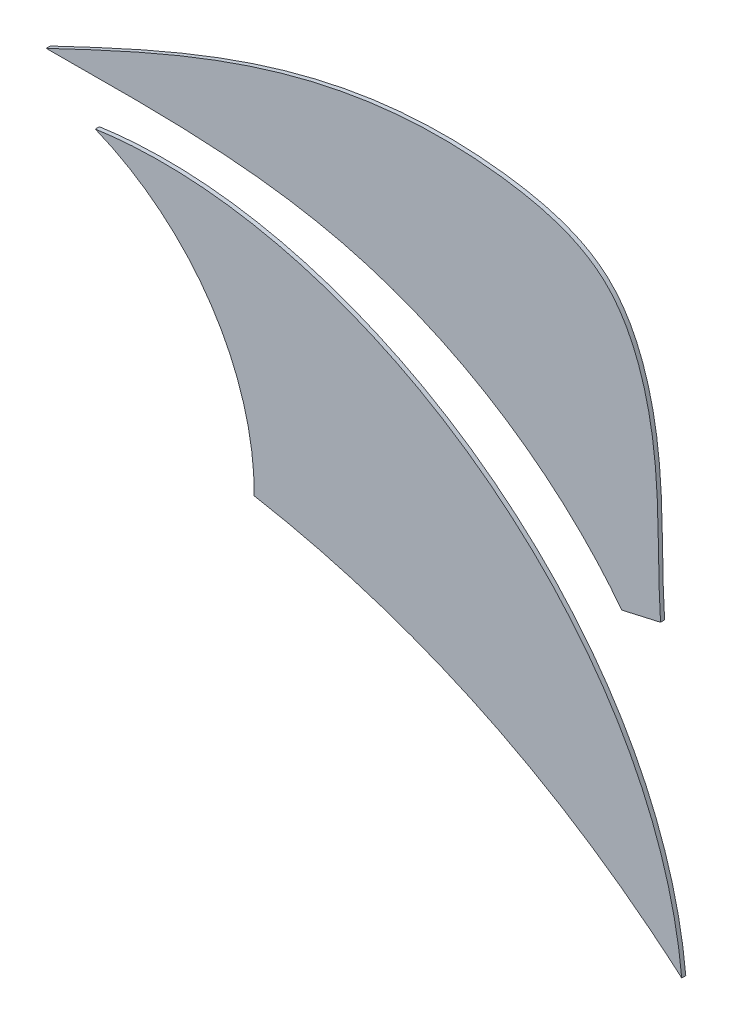
ISO-10303-21;
HEADER;
FILE_DESCRIPTION(('STEP AP214'),'2;1');
FILE_NAME('part.step','',(''),(''),'','','');
FILE_SCHEMA(('AUTOMOTIVE_DESIGN { 1 0 10303 214 1 1 1 1 }'));
ENDSEC;
DATA;
#1=APPLICATION_CONTEXT('core data for automotive mechanical design processes');
#2=APPLICATION_PROTOCOL_DEFINITION('international standard','automotive_design',2000,#1);
#3=PRODUCT_CONTEXT('',#1,'mechanical');
#4=PRODUCT('Part','Part','',(#3));
#5=PRODUCT_RELATED_PRODUCT_CATEGORY('part','',(#4));
#6=PRODUCT_DEFINITION_FORMATION('','',#4);
#7=PRODUCT_DEFINITION_CONTEXT('part definition',#1,'design');
#8=PRODUCT_DEFINITION('design','',#6,#7);
#9=PRODUCT_DEFINITION_SHAPE('','',#8);
#10=(LENGTH_UNIT() NAMED_UNIT(*) SI_UNIT(.MILLI.,.METRE.));
#11=(NAMED_UNIT(*) PLANE_ANGLE_UNIT() SI_UNIT($,.RADIAN.));
#12=(NAMED_UNIT(*) SI_UNIT($,.STERADIAN.) SOLID_ANGLE_UNIT());
#13=UNCERTAINTY_MEASURE_WITH_UNIT(LENGTH_MEASURE(1.E-05),#10,'distance_accuracy_value','');
#14=(GEOMETRIC_REPRESENTATION_CONTEXT(3) GLOBAL_UNCERTAINTY_ASSIGNED_CONTEXT((#13)) GLOBAL_UNIT_ASSIGNED_CONTEXT((#10,
#11,#12)) REPRESENTATION_CONTEXT('',''));
#15=CARTESIAN_POINT('',(0.,0.,0.));
#16=DIRECTION('',(0.,0.,1.));
#17=DIRECTION('',(1.,0.,0.));
#18=AXIS2_PLACEMENT_3D('',#15,#16,#17);
#19=CARTESIAN_POINT('',(-12.604061511027,13.5285490469243,0.6));
#20=CARTESIAN_POINT('',(-16.5763308281484,54.6631563552103,0.6));
#21=CARTESIAN_POINT('',(-59.4761934889544,84.373919060689,0.6));
#22=CARTESIAN_POINT('',(-99.0383095872289,78.678306614826,0.6));
#23=B_SPLINE_CURVE_WITH_KNOTS('',3,(#19,#20,#21,#22),.UNSPECIFIED.,.F.,.F.,(4,4),(0.,1.),.UNSPECIFIED.);
#24=DIRECTION('',(0.,0.,-1.));
#25=VECTOR('',#24,1.);
#26=SURFACE_OF_LINEAR_EXTRUSION('',#23,#25);
#27=CARTESIAN_POINT('',(-12.604061511027,13.5285490469243,0.));
#28=CARTESIAN_POINT('',(-16.5763308281484,54.6631563552103,0.));
#29=CARTESIAN_POINT('',(-59.4761934889544,84.373919060689,0.));
#30=CARTESIAN_POINT('',(-99.0383095872289,78.678306614826,0.));
#31=B_SPLINE_CURVE_WITH_KNOTS('',3,(#27,#28,#29,#30),.UNSPECIFIED.,.F.,.F.,(4,4),(0.,1.),.UNSPECIFIED.);
#32=CARTESIAN_POINT('',(-12.6040613969995,13.5285489480861,0.));
#33=VERTEX_POINT('',#32);
#34=CARTESIAN_POINT('',(-99.0383095872289,78.678306614826,0.));
#35=VERTEX_POINT('',#34);
#36=EDGE_CURVE('E12',#33,#35,#31,.T.);
#37=ORIENTED_EDGE('',*,*,#36,.T.);
#38=DIRECTION('',(0.,0.,-1.));
#39=VECTOR('',#38,1.);
#40=CARTESIAN_POINT('',(-99.0383095872289,78.678306614826,0.6));
#41=LINE('',#40,#39);
#42=CARTESIAN_POINT('',(-99.0383095872289,78.678306614826,0.6));
#43=VERTEX_POINT('',#42);
#44=EDGE_CURVE('E128',#43,#35,#41,.T.);
#45=ORIENTED_EDGE('',*,*,#44,.F.);
#46=CARTESIAN_POINT('',(-12.6040613969995,13.5285489480861,0.6));
#47=VERTEX_POINT('',#46);
#48=EDGE_CURVE('E55',#47,#43,#23,.T.);
#49=ORIENTED_EDGE('',*,*,#48,.F.);
#50=DIRECTION('',(0.,0.,-1.));
#51=VECTOR('',#50,1.);
#52=CARTESIAN_POINT('',(-12.6040613969995,13.5285489480861,0.6));
#53=LINE('',#52,#51);
#54=EDGE_CURVE('E96',#47,#33,#53,.T.);
#55=ORIENTED_EDGE('',*,*,#54,.T.);
#56=EDGE_LOOP('',(#37,#45,#49,#55));
#57=FACE_BOUND('',#56,.T.);
#58=ADVANCED_FACE('F51',(#57),#26,.F.);
#59=CARTESIAN_POINT('',(-113.180223453903,43.8762909601679,0.6));
#60=DIRECTION('',(0.,0.,-1.));
#61=DIRECTION('',(-1.,0.,0.));
#62=AXIS2_PLACEMENT_3D('',#59,#60,#61);
#63=CYLINDRICAL_SURFACE('',#62,37.5655962476237);
#64=CARTESIAN_POINT('',(-113.180223453903,43.8762909601679,0.));
#65=DIRECTION('',(0.,0.,-1.));
#66=DIRECTION('',(1.,0.,0.));
#67=AXIS2_PLACEMENT_3D('',#64,#65,#66);
#68=CIRCLE('',#67,37.5655962476237);
#69=CARTESIAN_POINT('',(-75.6158749428923,43.570118884184,0.));
#70=VERTEX_POINT('',#69);
#71=EDGE_CURVE('E64',#35,#70,#68,.T.);
#72=ORIENTED_EDGE('',*,*,#71,.T.);
#73=DIRECTION('',(0.,0.,-1.));
#74=VECTOR('',#73,1.);
#75=CARTESIAN_POINT('',(-75.6158749428923,43.570118884184,0.6));
#76=LINE('',#75,#74);
#77=CARTESIAN_POINT('',(-75.6158749428923,43.570118884184,0.6));
#78=VERTEX_POINT('',#77);
#79=EDGE_CURVE('E98',#78,#70,#76,.T.);
#80=ORIENTED_EDGE('',*,*,#79,.F.);
#81=CARTESIAN_POINT('',(-113.180223453903,43.8762909601679,0.6));
#82=DIRECTION('',(0.,0.,-1.));
#83=DIRECTION('',(1.,0.,0.));
#84=AXIS2_PLACEMENT_3D('',#81,#82,#83);
#85=CIRCLE('',#84,37.5655962476237);
#86=EDGE_CURVE('E85',#43,#78,#85,.T.);
#87=ORIENTED_EDGE('',*,*,#86,.F.);
#88=ORIENTED_EDGE('',*,*,#44,.T.);
#89=EDGE_LOOP('',(#72,#80,#87,#88));
#90=FACE_BOUND('',#89,.T.);
#91=ADVANCED_FACE('F111',(#90),#63,.F.);
#92=CARTESIAN_POINT('',(-455913.673790544,-890155.177278223,0.6));
#93=CARTESIAN_POINT('',(441538.938999984,897254.289809783,0.6));
#94=CARTESIAN_POINT('',(-427326.468098657,-904224.741316499,0.6));
#95=B_SPLINE_CURVE_WITH_KNOTS('',2,(#92,#93,#94),.UNSPECIFIED.,.F.,.F.,(3,3),(0.,1.),.UNSPECIFIED.);
#96=DIRECTION('',(0.,0.,-1.));
#97=VECTOR('',#96,1.);
#98=SURFACE_OF_LINEAR_EXTRUSION('',#95,#97);
#99=CARTESIAN_POINT('',(-455913.673790544,-890155.177278223,0.));
#100=CARTESIAN_POINT('',(441538.938999984,897254.289809783,0.));
#101=CARTESIAN_POINT('',(-427326.468098657,-904224.741316499,0.));
#102=B_SPLINE_CURVE_WITH_KNOTS('',2,(#99,#100,#101),.UNSPECIFIED.,.F.,.F.,(3,3),(0.,1.),.UNSPECIFIED.);
#103=EDGE_CURVE('E92',#70,#33,#102,.T.);
#104=ORIENTED_EDGE('',*,*,#103,.T.);
#105=ORIENTED_EDGE('',*,*,#54,.F.);
#106=EDGE_CURVE('E102',#78,#47,#95,.T.);
#107=ORIENTED_EDGE('',*,*,#106,.F.);
#108=ORIENTED_EDGE('',*,*,#79,.T.);
#109=EDGE_LOOP('',(#104,#105,#107,#108));
#110=FACE_BOUND('',#109,.T.);
#111=ADVANCED_FACE('F94',(#110),#98,.F.);
#112=CARTESIAN_POINT('',(-42.4749930061955,63.664760238681,0.6));
#113=DIRECTION('',(0.,0.,-1.));
#114=DIRECTION('',(-1.,0.,0.));
#115=AXIS2_PLACEMENT_3D('',#112,#113,#114);
#116=PLANE('',#115);
#117=ORIENTED_EDGE('',*,*,#48,.T.);
#118=ORIENTED_EDGE('',*,*,#86,.T.);
#119=ORIENTED_EDGE('',*,*,#106,.T.);
#120=EDGE_LOOP('',(#117,#118,#119));
#121=FACE_BOUND('',#120,.T.);
#122=ADVANCED_FACE('F53',(#121),#116,.F.);
#123=CARTESIAN_POINT('',(-42.4749930061955,63.664760238681,0.));
#124=DIRECTION('',(0.,0.,-1.));
#125=DIRECTION('',(-1.,0.,0.));
#126=AXIS2_PLACEMENT_3D('',#123,#124,#125);
#127=PLANE('',#126);
#128=ORIENTED_EDGE('',*,*,#36,.F.);
#129=ORIENTED_EDGE('',*,*,#103,.F.);
#130=ORIENTED_EDGE('',*,*,#71,.F.);
#131=EDGE_LOOP('',(#128,#129,#130));
#132=FACE_BOUND('',#131,.T.);
#133=ADVANCED_FACE('F104',(#132),#127,.T.);
#134=CLOSED_SHELL('',(#58,#91,#111,#122,#133));
#135=MANIFOLD_SOLID_BREP('B2',#134);
#136=CARTESIAN_POINT('',(-15.7324356038387,57.3725369791131,0.6));
#137=CARTESIAN_POINT('',(-16.3528748442375,66.6176840384339,0.6));
#138=CARTESIAN_POINT('',(-15.0941289247524,80.1408154700094,0.6));
#139=CARTESIAN_POINT('',(-23.0528951268825,99.1548395205853,0.6));
#140=CARTESIAN_POINT('',(-58.218524544496,108.015164996985,0.6));
#141=CARTESIAN_POINT('',(-85.4083096719593,95.3035572122187,0.6));
#142=CARTESIAN_POINT('',(-106.280242173504,85.3604745037555,0.6));
#143=B_SPLINE_CURVE_WITH_KNOTS('',3,(#136,#137,#138,#139,#140,#141,#142),.UNSPECIFIED.,.F.,.F.,
(4,1,1,1,4),(0.,0.217981108823508,0.32073340400496,0.449686820030178,1.),.UNSPECIFIED.);
#144=DIRECTION('',(0.,0.,-1.));
#145=VECTOR('',#144,1.);
#146=SURFACE_OF_LINEAR_EXTRUSION('',#143,#145);
#147=CARTESIAN_POINT('',(-15.7324356038387,57.3725369791131,0.));
#148=CARTESIAN_POINT('',(-16.3528748442375,66.6176840384339,0.));
#149=CARTESIAN_POINT('',(-15.0941289247524,80.1408154700094,0.));
#150=CARTESIAN_POINT('',(-23.0528951268825,99.1548395205853,0.));
#151=CARTESIAN_POINT('',(-58.218524544496,108.015164996985,0.));
#152=CARTESIAN_POINT('',(-85.4083096719593,95.3035572122187,0.));
#153=CARTESIAN_POINT('',(-106.280242173504,85.3604745037555,0.));
#154=B_SPLINE_CURVE_WITH_KNOTS('',3,(#147,#148,#149,#150,#151,#152,#153),.UNSPECIFIED.,.F.,.F.,
(4,1,1,1,4),(0.,0.217981108823508,0.32073340400496,0.449686820030178,1.),.UNSPECIFIED.);
#155=CARTESIAN_POINT('',(-15.7324356038387,57.3725369791131,0.));
#156=VERTEX_POINT('',#155);
#157=CARTESIAN_POINT('',(-106.280242173504,85.3604745037555,0.));
#158=VERTEX_POINT('',#157);
#159=EDGE_CURVE('E218',#156,#158,#154,.T.);
#160=ORIENTED_EDGE('',*,*,#159,.T.);
#161=DIRECTION('',(0.,0.,-1.));
#162=VECTOR('',#161,1.);
#163=CARTESIAN_POINT('',(-106.280242173504,85.3604745037555,0.6));
#164=LINE('',#163,#162);
#165=CARTESIAN_POINT('',(-106.280242173504,85.3604745037555,0.6));
#166=VERTEX_POINT('',#165);
#167=EDGE_CURVE('E49',#166,#158,#164,.T.);
#168=ORIENTED_EDGE('',*,*,#167,.F.);
#169=CARTESIAN_POINT('',(-15.7324356038387,57.3725369791131,0.6));
#170=VERTEX_POINT('',#169);
#171=EDGE_CURVE('E212',#170,#166,#143,.T.);
#172=ORIENTED_EDGE('',*,*,#171,.F.);
#173=DIRECTION('',(0.,0.,-1.));
#174=VECTOR('',#173,1.);
#175=CARTESIAN_POINT('',(-15.7324356038387,57.3725369791131,0.6));
#176=LINE('',#175,#174);
#177=EDGE_CURVE('E219',#170,#156,#176,.T.);
#178=ORIENTED_EDGE('',*,*,#177,.T.);
#179=EDGE_LOOP('',(#160,#168,#172,#178));
#180=FACE_BOUND('',#179,.T.);
#181=ADVANCED_FACE('F171',(#180),#146,.F.);
#182=CARTESIAN_POINT('',(-106.280242173504,85.3604745037555,0.6));
#183=CARTESIAN_POINT('',(-91.1852455658901,85.4155679046701,0.6));
#184=CARTESIAN_POINT('',(-59.0530589089791,86.3601694600936,0.6));
#185=CARTESIAN_POINT('',(-31.0882362863042,68.6732033686036,0.6));
#186=CARTESIAN_POINT('',(-21.4304285908596,56.0752655647971,0.6));
#187=B_SPLINE_CURVE_WITH_KNOTS('',3,(#182,#183,#184,#185,#186),.UNSPECIFIED.,.F.,.F.,(4,1,4),
(0.,0.491735089073558,1.),.UNSPECIFIED.);
#188=DIRECTION('',(0.,0.,-1.));
#189=VECTOR('',#188,1.);
#190=SURFACE_OF_LINEAR_EXTRUSION('',#187,#189);
#191=CARTESIAN_POINT('',(-106.280242173504,85.3604745037555,0.));
#192=CARTESIAN_POINT('',(-91.1852455658901,85.4155679046701,0.));
#193=CARTESIAN_POINT('',(-59.0530589089791,86.3601694600936,0.));
#194=CARTESIAN_POINT('',(-31.0882362863042,68.6732033686036,0.));
#195=CARTESIAN_POINT('',(-21.4304285908596,56.0752655647971,0.));
#196=B_SPLINE_CURVE_WITH_KNOTS('',3,(#191,#192,#193,#194,#195),.UNSPECIFIED.,.F.,.F.,(4,1,4),
(0.,0.491735089073558,1.),.UNSPECIFIED.);
#197=CARTESIAN_POINT('',(-21.4304285908596,56.0752655647971,0.));
#198=VERTEX_POINT('',#197);
#199=EDGE_CURVE('E200',#158,#198,#196,.T.);
#200=ORIENTED_EDGE('',*,*,#199,.T.);
#201=DIRECTION('',(0.,0.,-1.));
#202=VECTOR('',#201,1.);
#203=CARTESIAN_POINT('',(-21.4304285908596,56.0752655647971,0.6));
#204=LINE('',#203,#202);
#205=CARTESIAN_POINT('',(-21.4304285908596,56.0752655647971,0.6));
#206=VERTEX_POINT('',#205);
#207=EDGE_CURVE('E180',#206,#198,#204,.T.);
#208=ORIENTED_EDGE('',*,*,#207,.F.);
#209=EDGE_CURVE('E208',#166,#206,#187,.T.);
#210=ORIENTED_EDGE('',*,*,#209,.F.);
#211=ORIENTED_EDGE('',*,*,#167,.T.);
#212=EDGE_LOOP('',(#200,#208,#210,#211));
#213=FACE_BOUND('',#212,.T.);
#214=ADVANCED_FACE('F209',(#213),#190,.F.);
#215=CARTESIAN_POINT('',(-21.4304285908596,56.0752655647971,0.6));
#216=DIRECTION('',(-0.221990943918612,0.975048727407058,0.));
#217=DIRECTION('',(-0.975048727407058,-0.221990943918612,0.));
#218=AXIS2_PLACEMENT_3D('',#215,#216,#217);
#219=PLANE('',#218);
#220=DIRECTION('',(0.975048727407058,0.221990943918612,0.));
#221=VECTOR('',#220,1.);
#222=CARTESIAN_POINT('',(-21.4304285908596,56.0752655647971,0.));
#223=LINE('',#222,#221);
#224=EDGE_CURVE('E205',#198,#156,#223,.T.);
#225=ORIENTED_EDGE('',*,*,#224,.T.);
#226=ORIENTED_EDGE('',*,*,#177,.F.);
#227=DIRECTION('',(0.975048727407058,0.221990943918612,0.));
#228=VECTOR('',#227,1.);
#229=CARTESIAN_POINT('',(-21.4304285908596,56.0752655647971,0.6));
#230=LINE('',#229,#228);
#231=EDGE_CURVE('E188',#206,#170,#230,.T.);
#232=ORIENTED_EDGE('',*,*,#231,.F.);
#233=ORIENTED_EDGE('',*,*,#207,.T.);
#234=EDGE_LOOP('',(#225,#226,#232,#233));
#235=FACE_BOUND('',#234,.T.);
#236=ADVANCED_FACE('F236',(#235),#219,.F.);
#237=CARTESIAN_POINT('',(-45.7414422038395,103.029511360288,0.6));
#238=DIRECTION('',(0.,0.,1.));
#239=DIRECTION('',(1.,0.,0.));
#240=AXIS2_PLACEMENT_3D('',#237,#238,#239);
#241=PLANE('',#240);
#242=ORIENTED_EDGE('',*,*,#171,.T.);
#243=ORIENTED_EDGE('',*,*,#209,.T.);
#244=ORIENTED_EDGE('',*,*,#231,.T.);
#245=EDGE_LOOP('',(#242,#243,#244));
#246=FACE_BOUND('',#245,.T.);
#247=ADVANCED_FACE('F215',(#246),#241,.T.);
#248=CARTESIAN_POINT('',(-45.7414422038395,103.029511360288,0.));
#249=DIRECTION('',(0.,0.,1.));
#250=DIRECTION('',(1.,0.,0.));
#251=AXIS2_PLACEMENT_3D('',#248,#249,#250);
#252=PLANE('',#251);
#253=ORIENTED_EDGE('',*,*,#159,.F.);
#254=ORIENTED_EDGE('',*,*,#224,.F.);
#255=ORIENTED_EDGE('',*,*,#199,.F.);
#256=EDGE_LOOP('',(#253,#254,#255));
#257=FACE_BOUND('',#256,.T.);
#258=ADVANCED_FACE('F237',(#257),#252,.F.);
#259=CLOSED_SHELL('',(#181,#214,#236,#247,#258));
#260=MANIFOLD_SOLID_BREP('B6',#259);
#261=ADVANCED_BREP_SHAPE_REPRESENTATION('',(#18,#135,#260),#14);
#262=SHAPE_DEFINITION_REPRESENTATION(#9,#261);
ENDSEC;
END-ISO-10303-21;
